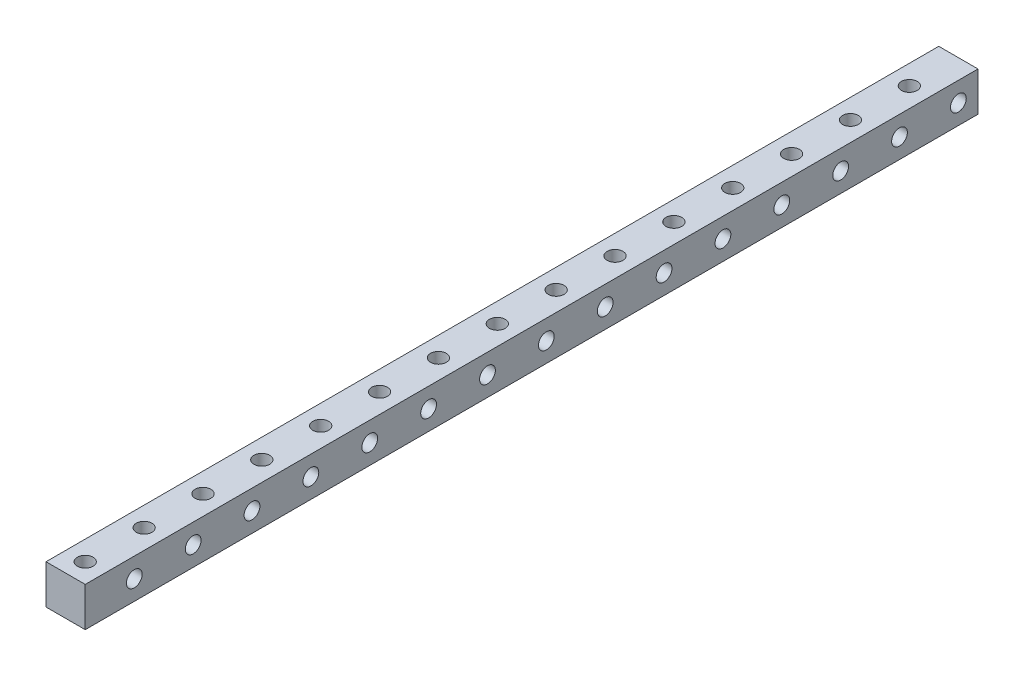
ISO-10303-21;
HEADER;
FILE_DESCRIPTION(('STEP AP214'),'2;1');
FILE_NAME('part.step','',(''),(''),'','','');
FILE_SCHEMA(('AUTOMOTIVE_DESIGN { 1 0 10303 214 1 1 1 1 }'));
ENDSEC;
DATA;
#1=APPLICATION_CONTEXT('core data for automotive mechanical design processes');
#2=APPLICATION_PROTOCOL_DEFINITION('international standard','automotive_design',2000,#1);
#3=PRODUCT_CONTEXT('',#1,'mechanical');
#4=PRODUCT('Part','Part','',(#3));
#5=PRODUCT_RELATED_PRODUCT_CATEGORY('part','',(#4));
#6=PRODUCT_DEFINITION_FORMATION('','',#4);
#7=PRODUCT_DEFINITION_CONTEXT('part definition',#1,'design');
#8=PRODUCT_DEFINITION('design','',#6,#7);
#9=PRODUCT_DEFINITION_SHAPE('','',#8);
#10=(LENGTH_UNIT() NAMED_UNIT(*) SI_UNIT(.MILLI.,.METRE.));
#11=(NAMED_UNIT(*) PLANE_ANGLE_UNIT() SI_UNIT($,.RADIAN.));
#12=(NAMED_UNIT(*) SI_UNIT($,.STERADIAN.) SOLID_ANGLE_UNIT());
#13=UNCERTAINTY_MEASURE_WITH_UNIT(LENGTH_MEASURE(1.E-05),#10,'distance_accuracy_value','');
#14=(GEOMETRIC_REPRESENTATION_CONTEXT(3) GLOBAL_UNCERTAINTY_ASSIGNED_CONTEXT((#13)) GLOBAL_UNIT_ASSIGNED_CONTEXT((#10,
#11,#12)) REPRESENTATION_CONTEXT('',''));
#15=CARTESIAN_POINT('',(0.,0.,0.));
#16=DIRECTION('',(0.,0.,1.));
#17=DIRECTION('',(1.,0.,0.));
#18=AXIS2_PLACEMENT_3D('',#15,#16,#17);
#19=CARTESIAN_POINT('',(6.35,0.,-282.575));
#20=DIRECTION('',(1.,0.,0.));
#21=DIRECTION('',(0.,0.,-1.));
#22=AXIS2_PLACEMENT_3D('',#19,#20,#21);
#23=CYLINDRICAL_SURFACE('',#22,2.55270000000002);
#24=CARTESIAN_POINT('',(6.35,0.,-282.575));
#25=DIRECTION('',(1.,0.,0.));
#26=DIRECTION('',(0.,0.,-1.));
#27=AXIS2_PLACEMENT_3D('',#24,#25,#26);
#28=CIRCLE('',#27,2.55270000000002);
#29=CARTESIAN_POINT('',(6.35,0.,-285.1277));
#30=VERTEX_POINT('',#29);
#31=EDGE_CURVE('E107',#30,#30,#28,.F.);
#32=ORIENTED_EDGE('',*,*,#31,.F.);
#33=EDGE_LOOP('',(#32));
#34=FACE_BOUND('',#33,.T.);
#35=CARTESIAN_POINT('',(-6.35,0.,-282.575));
#36=DIRECTION('',(1.,0.,0.));
#37=DIRECTION('',(0.,0.,-1.));
#38=AXIS2_PLACEMENT_3D('',#35,#36,#37);
#39=CIRCLE('',#38,2.55270000000002);
#40=CARTESIAN_POINT('',(-6.35,0.,-285.1277));
#41=VERTEX_POINT('',#40);
#42=EDGE_CURVE('E100',#41,#41,#39,.T.);
#43=ORIENTED_EDGE('',*,*,#42,.F.);
#44=EDGE_LOOP('',(#43));
#45=FACE_BOUND('',#44,.T.);
#46=ADVANCED_FACE('F20',(#34,#45),#23,.F.);
#47=CARTESIAN_POINT('',(6.35,0.,-263.525));
#48=DIRECTION('',(1.,0.,0.));
#49=DIRECTION('',(0.,0.,-1.));
#50=AXIS2_PLACEMENT_3D('',#47,#48,#49);
#51=CYLINDRICAL_SURFACE('',#50,2.55270000000002);
#52=CARTESIAN_POINT('',(6.35,0.,-263.525));
#53=DIRECTION('',(1.,0.,0.));
#54=DIRECTION('',(0.,0.,-1.));
#55=AXIS2_PLACEMENT_3D('',#52,#53,#54);
#56=CIRCLE('',#55,2.55270000000002);
#57=CARTESIAN_POINT('',(6.35,0.,-266.0777));
#58=VERTEX_POINT('',#57);
#59=EDGE_CURVE('E376',#58,#58,#56,.F.);
#60=ORIENTED_EDGE('',*,*,#59,.F.);
#61=EDGE_LOOP('',(#60));
#62=FACE_BOUND('',#61,.T.);
#63=CARTESIAN_POINT('',(-6.35,0.,-263.525));
#64=DIRECTION('',(1.,0.,0.));
#65=DIRECTION('',(0.,0.,-1.));
#66=AXIS2_PLACEMENT_3D('',#63,#64,#65);
#67=CIRCLE('',#66,2.55270000000002);
#68=CARTESIAN_POINT('',(-6.35,0.,-266.0777));
#69=VERTEX_POINT('',#68);
#70=EDGE_CURVE('E23',#69,#69,#67,.T.);
#71=ORIENTED_EDGE('',*,*,#70,.F.);
#72=EDGE_LOOP('',(#71));
#73=FACE_BOUND('',#72,.T.);
#74=ADVANCED_FACE('F182',(#62,#73),#51,.F.);
#75=CARTESIAN_POINT('',(6.35,0.,-244.475));
#76=DIRECTION('',(1.,0.,0.));
#77=DIRECTION('',(0.,0.,-1.));
#78=AXIS2_PLACEMENT_3D('',#75,#76,#77);
#79=CYLINDRICAL_SURFACE('',#78,2.55269999999999);
#80=CARTESIAN_POINT('',(6.35,0.,-244.475));
#81=DIRECTION('',(1.,0.,0.));
#82=DIRECTION('',(0.,0.,-1.));
#83=AXIS2_PLACEMENT_3D('',#80,#81,#82);
#84=CIRCLE('',#83,2.55269999999999);
#85=CARTESIAN_POINT('',(6.35,0.,-247.0277));
#86=VERTEX_POINT('',#85);
#87=EDGE_CURVE('E379',#86,#86,#84,.F.);
#88=ORIENTED_EDGE('',*,*,#87,.F.);
#89=EDGE_LOOP('',(#88));
#90=FACE_BOUND('',#89,.T.);
#91=CARTESIAN_POINT('',(-6.35,0.,-244.475));
#92=DIRECTION('',(1.,0.,0.));
#93=DIRECTION('',(0.,0.,-1.));
#94=AXIS2_PLACEMENT_3D('',#91,#92,#93);
#95=CIRCLE('',#94,2.55269999999999);
#96=CARTESIAN_POINT('',(-6.35,0.,-247.0277));
#97=VERTEX_POINT('',#96);
#98=EDGE_CURVE('E106',#97,#97,#95,.T.);
#99=ORIENTED_EDGE('',*,*,#98,.F.);
#100=EDGE_LOOP('',(#99));
#101=FACE_BOUND('',#100,.T.);
#102=ADVANCED_FACE('F184',(#90,#101),#79,.F.);
#103=CARTESIAN_POINT('',(6.35,0.,-225.425));
#104=DIRECTION('',(1.,0.,0.));
#105=DIRECTION('',(0.,0.,-1.));
#106=AXIS2_PLACEMENT_3D('',#103,#104,#105);
#107=CYLINDRICAL_SURFACE('',#106,2.55269999999999);
#108=CARTESIAN_POINT('',(6.35,0.,-225.425));
#109=DIRECTION('',(1.,0.,0.));
#110=DIRECTION('',(0.,0.,-1.));
#111=AXIS2_PLACEMENT_3D('',#108,#109,#110);
#112=CIRCLE('',#111,2.55269999999999);
#113=CARTESIAN_POINT('',(6.35,0.,-227.9777));
#114=VERTEX_POINT('',#113);
#115=EDGE_CURVE('E330',#114,#114,#112,.F.);
#116=ORIENTED_EDGE('',*,*,#115,.F.);
#117=EDGE_LOOP('',(#116));
#118=FACE_BOUND('',#117,.T.);
#119=CARTESIAN_POINT('',(-6.35,0.,-225.425));
#120=DIRECTION('',(1.,0.,0.));
#121=DIRECTION('',(0.,0.,-1.));
#122=AXIS2_PLACEMENT_3D('',#119,#120,#121);
#123=CIRCLE('',#122,2.55269999999999);
#124=CARTESIAN_POINT('',(-6.35,0.,-227.9777));
#125=VERTEX_POINT('',#124);
#126=EDGE_CURVE('E113',#125,#125,#123,.T.);
#127=ORIENTED_EDGE('',*,*,#126,.F.);
#128=EDGE_LOOP('',(#127));
#129=FACE_BOUND('',#128,.T.);
#130=ADVANCED_FACE('F191',(#118,#129),#107,.F.);
#131=CARTESIAN_POINT('',(6.35,0.,-206.375));
#132=DIRECTION('',(1.,0.,0.));
#133=DIRECTION('',(0.,0.,-1.));
#134=AXIS2_PLACEMENT_3D('',#131,#132,#133);
#135=CYLINDRICAL_SURFACE('',#134,2.55269999999999);
#136=CARTESIAN_POINT('',(6.35,0.,-206.375));
#137=DIRECTION('',(1.,0.,0.));
#138=DIRECTION('',(0.,0.,-1.));
#139=AXIS2_PLACEMENT_3D('',#136,#137,#138);
#140=CIRCLE('',#139,2.55269999999999);
#141=CARTESIAN_POINT('',(6.35,0.,-208.9277));
#142=VERTEX_POINT('',#141);
#143=EDGE_CURVE('E384',#142,#142,#140,.F.);
#144=ORIENTED_EDGE('',*,*,#143,.F.);
#145=EDGE_LOOP('',(#144));
#146=FACE_BOUND('',#145,.T.);
#147=CARTESIAN_POINT('',(-6.35,0.,-206.375));
#148=DIRECTION('',(1.,0.,0.));
#149=DIRECTION('',(0.,0.,-1.));
#150=AXIS2_PLACEMENT_3D('',#147,#148,#149);
#151=CIRCLE('',#150,2.55269999999999);
#152=CARTESIAN_POINT('',(-6.35,0.,-208.9277));
#153=VERTEX_POINT('',#152);
#154=EDGE_CURVE('E171',#153,#153,#151,.T.);
#155=ORIENTED_EDGE('',*,*,#154,.F.);
#156=EDGE_LOOP('',(#155));
#157=FACE_BOUND('',#156,.T.);
#158=ADVANCED_FACE('F318',(#146,#157),#135,.F.);
#159=CARTESIAN_POINT('',(6.35,0.,-187.325));
#160=DIRECTION('',(1.,0.,0.));
#161=DIRECTION('',(0.,0.,-1.));
#162=AXIS2_PLACEMENT_3D('',#159,#160,#161);
#163=CYLINDRICAL_SURFACE('',#162,2.55269999999999);
#164=CARTESIAN_POINT('',(6.35,0.,-187.325));
#165=DIRECTION('',(1.,0.,0.));
#166=DIRECTION('',(0.,0.,-1.));
#167=AXIS2_PLACEMENT_3D('',#164,#165,#166);
#168=CIRCLE('',#167,2.55269999999999);
#169=CARTESIAN_POINT('',(6.35,0.,-189.8777));
#170=VERTEX_POINT('',#169);
#171=EDGE_CURVE('E388',#170,#170,#168,.F.);
#172=ORIENTED_EDGE('',*,*,#171,.F.);
#173=EDGE_LOOP('',(#172));
#174=FACE_BOUND('',#173,.T.);
#175=CARTESIAN_POINT('',(-6.35,0.,-187.325));
#176=DIRECTION('',(1.,0.,0.));
#177=DIRECTION('',(0.,0.,-1.));
#178=AXIS2_PLACEMENT_3D('',#175,#176,#177);
#179=CIRCLE('',#178,2.55269999999999);
#180=CARTESIAN_POINT('',(-6.35,0.,-189.8777));
#181=VERTEX_POINT('',#180);
#182=EDGE_CURVE('E118',#181,#181,#179,.T.);
#183=ORIENTED_EDGE('',*,*,#182,.F.);
#184=EDGE_LOOP('',(#183));
#185=FACE_BOUND('',#184,.T.);
#186=ADVANCED_FACE('F314',(#174,#185),#163,.F.);
#187=CARTESIAN_POINT('',(6.35,0.,-168.275));
#188=DIRECTION('',(1.,0.,0.));
#189=DIRECTION('',(0.,0.,-1.));
#190=AXIS2_PLACEMENT_3D('',#187,#188,#189);
#191=CYLINDRICAL_SURFACE('',#190,2.55269999999999);
#192=CARTESIAN_POINT('',(6.35,0.,-168.275));
#193=DIRECTION('',(1.,0.,0.));
#194=DIRECTION('',(0.,0.,-1.));
#195=AXIS2_PLACEMENT_3D('',#192,#193,#194);
#196=CIRCLE('',#195,2.55269999999999);
#197=CARTESIAN_POINT('',(6.35,0.,-170.8277));
#198=VERTEX_POINT('',#197);
#199=EDGE_CURVE('E392',#198,#198,#196,.F.);
#200=ORIENTED_EDGE('',*,*,#199,.F.);
#201=EDGE_LOOP('',(#200));
#202=FACE_BOUND('',#201,.T.);
#203=CARTESIAN_POINT('',(-6.35,0.,-168.275));
#204=DIRECTION('',(1.,0.,0.));
#205=DIRECTION('',(0.,0.,-1.));
#206=AXIS2_PLACEMENT_3D('',#203,#204,#205);
#207=CIRCLE('',#206,2.55269999999999);
#208=CARTESIAN_POINT('',(-6.35,0.,-170.8277));
#209=VERTEX_POINT('',#208);
#210=EDGE_CURVE('E167',#209,#209,#207,.T.);
#211=ORIENTED_EDGE('',*,*,#210,.F.);
#212=EDGE_LOOP('',(#211));
#213=FACE_BOUND('',#212,.T.);
#214=ADVANCED_FACE('F310',(#202,#213),#191,.F.);
#215=CARTESIAN_POINT('',(6.35,0.,-149.225));
#216=DIRECTION('',(1.,0.,0.));
#217=DIRECTION('',(0.,0.,-1.));
#218=AXIS2_PLACEMENT_3D('',#215,#216,#217);
#219=CYLINDRICAL_SURFACE('',#218,2.55269999999999);
#220=CARTESIAN_POINT('',(6.35,0.,-149.225));
#221=DIRECTION('',(1.,0.,0.));
#222=DIRECTION('',(0.,0.,-1.));
#223=AXIS2_PLACEMENT_3D('',#220,#221,#222);
#224=CIRCLE('',#223,2.55269999999999);
#225=CARTESIAN_POINT('',(6.35,0.,-151.7777));
#226=VERTEX_POINT('',#225);
#227=EDGE_CURVE('E396',#226,#226,#224,.F.);
#228=ORIENTED_EDGE('',*,*,#227,.F.);
#229=EDGE_LOOP('',(#228));
#230=FACE_BOUND('',#229,.T.);
#231=CARTESIAN_POINT('',(-6.35,0.,-149.225));
#232=DIRECTION('',(1.,0.,0.));
#233=DIRECTION('',(0.,0.,-1.));
#234=AXIS2_PLACEMENT_3D('',#231,#232,#233);
#235=CIRCLE('',#234,2.55269999999999);
#236=CARTESIAN_POINT('',(-6.35,0.,-151.7777));
#237=VERTEX_POINT('',#236);
#238=EDGE_CURVE('E126',#237,#237,#235,.T.);
#239=ORIENTED_EDGE('',*,*,#238,.F.);
#240=EDGE_LOOP('',(#239));
#241=FACE_BOUND('',#240,.T.);
#242=ADVANCED_FACE('F306',(#230,#241),#219,.F.);
#243=CARTESIAN_POINT('',(6.35,0.,-130.175));
#244=DIRECTION('',(1.,0.,0.));
#245=DIRECTION('',(0.,0.,-1.));
#246=AXIS2_PLACEMENT_3D('',#243,#244,#245);
#247=CYLINDRICAL_SURFACE('',#246,2.55269999999999);
#248=CARTESIAN_POINT('',(6.35,0.,-130.175));
#249=DIRECTION('',(1.,0.,0.));
#250=DIRECTION('',(0.,0.,-1.));
#251=AXIS2_PLACEMENT_3D('',#248,#249,#250);
#252=CIRCLE('',#251,2.55269999999999);
#253=CARTESIAN_POINT('',(6.35,0.,-132.7277));
#254=VERTEX_POINT('',#253);
#255=EDGE_CURVE('E400',#254,#254,#252,.F.);
#256=ORIENTED_EDGE('',*,*,#255,.F.);
#257=EDGE_LOOP('',(#256));
#258=FACE_BOUND('',#257,.T.);
#259=CARTESIAN_POINT('',(-6.35,0.,-130.175));
#260=DIRECTION('',(1.,0.,0.));
#261=DIRECTION('',(0.,0.,-1.));
#262=AXIS2_PLACEMENT_3D('',#259,#260,#261);
#263=CIRCLE('',#262,2.55269999999999);
#264=CARTESIAN_POINT('',(-6.35,0.,-132.7277));
#265=VERTEX_POINT('',#264);
#266=EDGE_CURVE('E130',#265,#265,#263,.T.);
#267=ORIENTED_EDGE('',*,*,#266,.F.);
#268=EDGE_LOOP('',(#267));
#269=FACE_BOUND('',#268,.T.);
#270=ADVANCED_FACE('F302',(#258,#269),#247,.F.);
#271=CARTESIAN_POINT('',(6.35,0.,-111.125));
#272=DIRECTION('',(1.,0.,0.));
#273=DIRECTION('',(0.,0.,-1.));
#274=AXIS2_PLACEMENT_3D('',#271,#272,#273);
#275=CYLINDRICAL_SURFACE('',#274,2.55269999999999);
#276=CARTESIAN_POINT('',(6.35,0.,-111.125));
#277=DIRECTION('',(1.,0.,0.));
#278=DIRECTION('',(0.,0.,-1.));
#279=AXIS2_PLACEMENT_3D('',#276,#277,#278);
#280=CIRCLE('',#279,2.55269999999999);
#281=CARTESIAN_POINT('',(6.35,0.,-113.6777));
#282=VERTEX_POINT('',#281);
#283=EDGE_CURVE('E404',#282,#282,#280,.F.);
#284=ORIENTED_EDGE('',*,*,#283,.F.);
#285=EDGE_LOOP('',(#284));
#286=FACE_BOUND('',#285,.T.);
#287=CARTESIAN_POINT('',(-6.35,0.,-111.125));
#288=DIRECTION('',(1.,0.,0.));
#289=DIRECTION('',(0.,0.,-1.));
#290=AXIS2_PLACEMENT_3D('',#287,#288,#289);
#291=CIRCLE('',#290,2.55269999999999);
#292=CARTESIAN_POINT('',(-6.35,0.,-113.6777));
#293=VERTEX_POINT('',#292);
#294=EDGE_CURVE('E135',#293,#293,#291,.T.);
#295=ORIENTED_EDGE('',*,*,#294,.F.);
#296=EDGE_LOOP('',(#295));
#297=FACE_BOUND('',#296,.T.);
#298=ADVANCED_FACE('F298',(#286,#297),#275,.F.);
#299=CARTESIAN_POINT('',(6.35,0.,-92.075));
#300=DIRECTION('',(1.,0.,0.));
#301=DIRECTION('',(0.,0.,-1.));
#302=AXIS2_PLACEMENT_3D('',#299,#300,#301);
#303=CYLINDRICAL_SURFACE('',#302,2.55270000000001);
#304=CARTESIAN_POINT('',(6.35,0.,-92.075));
#305=DIRECTION('',(1.,0.,0.));
#306=DIRECTION('',(0.,0.,-1.));
#307=AXIS2_PLACEMENT_3D('',#304,#305,#306);
#308=CIRCLE('',#307,2.55270000000001);
#309=CARTESIAN_POINT('',(6.35,0.,-94.6277));
#310=VERTEX_POINT('',#309);
#311=EDGE_CURVE('E408',#310,#310,#308,.F.);
#312=ORIENTED_EDGE('',*,*,#311,.F.);
#313=EDGE_LOOP('',(#312));
#314=FACE_BOUND('',#313,.T.);
#315=CARTESIAN_POINT('',(-6.35,0.,-92.075));
#316=DIRECTION('',(1.,0.,0.));
#317=DIRECTION('',(0.,0.,-1.));
#318=AXIS2_PLACEMENT_3D('',#315,#316,#317);
#319=CIRCLE('',#318,2.55270000000001);
#320=CARTESIAN_POINT('',(-6.35,0.,-94.6277));
#321=VERTEX_POINT('',#320);
#322=EDGE_CURVE('E140',#321,#321,#319,.T.);
#323=ORIENTED_EDGE('',*,*,#322,.F.);
#324=EDGE_LOOP('',(#323));
#325=FACE_BOUND('',#324,.T.);
#326=ADVANCED_FACE('F294',(#314,#325),#303,.F.);
#327=CARTESIAN_POINT('',(6.35,0.,-73.025));
#328=DIRECTION('',(1.,0.,0.));
#329=DIRECTION('',(0.,0.,-1.));
#330=AXIS2_PLACEMENT_3D('',#327,#328,#329);
#331=CYLINDRICAL_SURFACE('',#330,2.55269999999999);
#332=CARTESIAN_POINT('',(6.35,0.,-73.025));
#333=DIRECTION('',(1.,0.,0.));
#334=DIRECTION('',(0.,0.,-1.));
#335=AXIS2_PLACEMENT_3D('',#332,#333,#334);
#336=CIRCLE('',#335,2.55269999999999);
#337=CARTESIAN_POINT('',(6.35,0.,-75.5777));
#338=VERTEX_POINT('',#337);
#339=EDGE_CURVE('E412',#338,#338,#336,.F.);
#340=ORIENTED_EDGE('',*,*,#339,.F.);
#341=EDGE_LOOP('',(#340));
#342=FACE_BOUND('',#341,.T.);
#343=CARTESIAN_POINT('',(-6.35,0.,-73.025));
#344=DIRECTION('',(1.,0.,0.));
#345=DIRECTION('',(0.,0.,-1.));
#346=AXIS2_PLACEMENT_3D('',#343,#344,#345);
#347=CIRCLE('',#346,2.55269999999999);
#348=CARTESIAN_POINT('',(-6.35,0.,-75.5777));
#349=VERTEX_POINT('',#348);
#350=EDGE_CURVE('E148',#349,#349,#347,.T.);
#351=ORIENTED_EDGE('',*,*,#350,.F.);
#352=EDGE_LOOP('',(#351));
#353=FACE_BOUND('',#352,.T.);
#354=ADVANCED_FACE('F290',(#342,#353),#331,.F.);
#355=CARTESIAN_POINT('',(6.35,0.,-53.975));
#356=DIRECTION('',(1.,0.,0.));
#357=DIRECTION('',(0.,0.,-1.));
#358=AXIS2_PLACEMENT_3D('',#355,#356,#357);
#359=CYLINDRICAL_SURFACE('',#358,2.5527);
#360=CARTESIAN_POINT('',(6.35,0.,-53.975));
#361=DIRECTION('',(1.,0.,0.));
#362=DIRECTION('',(0.,0.,-1.));
#363=AXIS2_PLACEMENT_3D('',#360,#361,#362);
#364=CIRCLE('',#363,2.5527);
#365=CARTESIAN_POINT('',(6.35,0.,-56.5277));
#366=VERTEX_POINT('',#365);
#367=EDGE_CURVE('E416',#366,#366,#364,.F.);
#368=ORIENTED_EDGE('',*,*,#367,.F.);
#369=EDGE_LOOP('',(#368));
#370=FACE_BOUND('',#369,.T.);
#371=CARTESIAN_POINT('',(-6.35,0.,-53.975));
#372=DIRECTION('',(1.,0.,0.));
#373=DIRECTION('',(0.,0.,-1.));
#374=AXIS2_PLACEMENT_3D('',#371,#372,#373);
#375=CIRCLE('',#374,2.5527);
#376=CARTESIAN_POINT('',(-6.35,0.,-56.5277));
#377=VERTEX_POINT('',#376);
#378=EDGE_CURVE('E152',#377,#377,#375,.T.);
#379=ORIENTED_EDGE('',*,*,#378,.F.);
#380=EDGE_LOOP('',(#379));
#381=FACE_BOUND('',#380,.T.);
#382=ADVANCED_FACE('F286',(#370,#381),#359,.F.);
#383=CARTESIAN_POINT('',(6.35,0.,-34.925));
#384=DIRECTION('',(1.,0.,0.));
#385=DIRECTION('',(0.,0.,-1.));
#386=AXIS2_PLACEMENT_3D('',#383,#384,#385);
#387=CYLINDRICAL_SURFACE('',#386,2.5527);
#388=CARTESIAN_POINT('',(6.35,0.,-34.925));
#389=DIRECTION('',(1.,0.,0.));
#390=DIRECTION('',(0.,0.,-1.));
#391=AXIS2_PLACEMENT_3D('',#388,#389,#390);
#392=CIRCLE('',#391,2.5527);
#393=CARTESIAN_POINT('',(6.35,0.,-37.4777));
#394=VERTEX_POINT('',#393);
#395=EDGE_CURVE('E420',#394,#394,#392,.F.);
#396=ORIENTED_EDGE('',*,*,#395,.F.);
#397=EDGE_LOOP('',(#396));
#398=FACE_BOUND('',#397,.T.);
#399=CARTESIAN_POINT('',(-6.35,0.,-34.925));
#400=DIRECTION('',(1.,0.,0.));
#401=DIRECTION('',(0.,0.,-1.));
#402=AXIS2_PLACEMENT_3D('',#399,#400,#401);
#403=CIRCLE('',#402,2.5527);
#404=CARTESIAN_POINT('',(-6.35,0.,-37.4777));
#405=VERTEX_POINT('',#404);
#406=EDGE_CURVE('E157',#405,#405,#403,.T.);
#407=ORIENTED_EDGE('',*,*,#406,.F.);
#408=EDGE_LOOP('',(#407));
#409=FACE_BOUND('',#408,.T.);
#410=ADVANCED_FACE('F282',(#398,#409),#387,.F.);
#411=CARTESIAN_POINT('',(6.35,0.,-15.875));
#412=DIRECTION('',(1.,0.,0.));
#413=DIRECTION('',(0.,0.,-1.));
#414=AXIS2_PLACEMENT_3D('',#411,#412,#413);
#415=CYLINDRICAL_SURFACE('',#414,2.5527);
#416=CARTESIAN_POINT('',(6.35,0.,-15.875));
#417=DIRECTION('',(1.,0.,0.));
#418=DIRECTION('',(0.,0.,-1.));
#419=AXIS2_PLACEMENT_3D('',#416,#417,#418);
#420=CIRCLE('',#419,2.5527);
#421=CARTESIAN_POINT('',(6.35,0.,-18.4277));
#422=VERTEX_POINT('',#421);
#423=EDGE_CURVE('E424',#422,#422,#420,.F.);
#424=ORIENTED_EDGE('',*,*,#423,.F.);
#425=EDGE_LOOP('',(#424));
#426=FACE_BOUND('',#425,.T.);
#427=CARTESIAN_POINT('',(-6.35,0.,-15.875));
#428=DIRECTION('',(1.,0.,0.));
#429=DIRECTION('',(0.,0.,-1.));
#430=AXIS2_PLACEMENT_3D('',#427,#428,#429);
#431=CIRCLE('',#430,2.5527);
#432=CARTESIAN_POINT('',(-6.35,0.,-18.4277));
#433=VERTEX_POINT('',#432);
#434=EDGE_CURVE('E162',#433,#433,#431,.T.);
#435=ORIENTED_EDGE('',*,*,#434,.F.);
#436=EDGE_LOOP('',(#435));
#437=FACE_BOUND('',#436,.T.);
#438=ADVANCED_FACE('F278',(#426,#437),#415,.F.);
#439=CARTESIAN_POINT('',(6.35,-6.35,-304.8));
#440=DIRECTION('',(0.,-1.,0.));
#441=DIRECTION('',(1.,0.,0.));
#442=AXIS2_PLACEMENT_3D('',#439,#440,#441);
#443=PLANE('',#442);
#444=CARTESIAN_POINT('',(0.,-6.35,-254.));
#445=DIRECTION('',(0.,1.,0.));
#446=DIRECTION('',(0.,0.,1.));
#447=AXIS2_PLACEMENT_3D('',#444,#445,#446);
#448=CIRCLE('',#447,2.55270000000002);
#449=CARTESIAN_POINT('',(0.,-6.35,-251.4473));
#450=VERTEX_POINT('',#449);
#451=EDGE_CURVE('E432',#450,#450,#448,.T.);
#452=ORIENTED_EDGE('',*,*,#451,.T.);
#453=EDGE_LOOP('',(#452));
#454=FACE_BOUND('',#453,.T.);
#455=CARTESIAN_POINT('',(0.,-6.35,-215.9));
#456=DIRECTION('',(0.,1.,0.));
#457=DIRECTION('',(0.,0.,1.));
#458=AXIS2_PLACEMENT_3D('',#455,#456,#457);
#459=CIRCLE('',#458,2.55269999999999);
#460=CARTESIAN_POINT('',(0.,-6.35,-213.3473));
#461=VERTEX_POINT('',#460);
#462=EDGE_CURVE('E439',#461,#461,#459,.T.);
#463=ORIENTED_EDGE('',*,*,#462,.T.);
#464=EDGE_LOOP('',(#463));
#465=FACE_BOUND('',#464,.T.);
#466=CARTESIAN_POINT('',(0.,-6.35,-196.85));
#467=DIRECTION('',(0.,1.,0.));
#468=DIRECTION('',(0.,0.,1.));
#469=AXIS2_PLACEMENT_3D('',#466,#467,#468);
#470=CIRCLE('',#469,2.55269999999999);
#471=CARTESIAN_POINT('',(0.,-6.35,-194.2973));
#472=VERTEX_POINT('',#471);
#473=EDGE_CURVE('E443',#472,#472,#470,.T.);
#474=ORIENTED_EDGE('',*,*,#473,.T.);
#475=EDGE_LOOP('',(#474));
#476=FACE_BOUND('',#475,.T.);
#477=CARTESIAN_POINT('',(0.,-6.35,-177.8));
#478=DIRECTION('',(0.,1.,0.));
#479=DIRECTION('',(0.,0.,1.));
#480=AXIS2_PLACEMENT_3D('',#477,#478,#479);
#481=CIRCLE('',#480,2.55269999999999);
#482=CARTESIAN_POINT('',(0.,-6.35,-175.2473));
#483=VERTEX_POINT('',#482);
#484=EDGE_CURVE('E447',#483,#483,#481,.T.);
#485=ORIENTED_EDGE('',*,*,#484,.T.);
#486=EDGE_LOOP('',(#485));
#487=FACE_BOUND('',#486,.T.);
#488=CARTESIAN_POINT('',(0.,-6.35,-158.75));
#489=DIRECTION('',(0.,1.,0.));
#490=DIRECTION('',(0.,0.,1.));
#491=AXIS2_PLACEMENT_3D('',#488,#489,#490);
#492=CIRCLE('',#491,2.55269999999999);
#493=CARTESIAN_POINT('',(0.,-6.35,-156.1973));
#494=VERTEX_POINT('',#493);
#495=EDGE_CURVE('E451',#494,#494,#492,.T.);
#496=ORIENTED_EDGE('',*,*,#495,.T.);
#497=EDGE_LOOP('',(#496));
#498=FACE_BOUND('',#497,.T.);
#499=CARTESIAN_POINT('',(0.,-6.35,-139.7));
#500=DIRECTION('',(0.,1.,0.));
#501=DIRECTION('',(0.,0.,1.));
#502=AXIS2_PLACEMENT_3D('',#499,#500,#501);
#503=CIRCLE('',#502,2.55269999999999);
#504=CARTESIAN_POINT('',(0.,-6.35,-137.1473));
#505=VERTEX_POINT('',#504);
#506=EDGE_CURVE('E455',#505,#505,#503,.T.);
#507=ORIENTED_EDGE('',*,*,#506,.T.);
#508=EDGE_LOOP('',(#507));
#509=FACE_BOUND('',#508,.T.);
#510=CARTESIAN_POINT('',(0.,-6.35,-120.65));
#511=DIRECTION('',(0.,1.,0.));
#512=DIRECTION('',(0.,0.,1.));
#513=AXIS2_PLACEMENT_3D('',#510,#511,#512);
#514=CIRCLE('',#513,2.55269999999999);
#515=CARTESIAN_POINT('',(0.,-6.35,-118.0973));
#516=VERTEX_POINT('',#515);
#517=EDGE_CURVE('E459',#516,#516,#514,.T.);
#518=ORIENTED_EDGE('',*,*,#517,.T.);
#519=EDGE_LOOP('',(#518));
#520=FACE_BOUND('',#519,.T.);
#521=CARTESIAN_POINT('',(0.,-6.35,-101.6));
#522=DIRECTION('',(0.,1.,0.));
#523=DIRECTION('',(0.,0.,1.));
#524=AXIS2_PLACEMENT_3D('',#521,#522,#523);
#525=CIRCLE('',#524,2.55269999999999);
#526=CARTESIAN_POINT('',(0.,-6.35,-99.0473));
#527=VERTEX_POINT('',#526);
#528=EDGE_CURVE('E463',#527,#527,#525,.T.);
#529=ORIENTED_EDGE('',*,*,#528,.T.);
#530=EDGE_LOOP('',(#529));
#531=FACE_BOUND('',#530,.T.);
#532=CARTESIAN_POINT('',(0.,-6.35,-82.55));
#533=DIRECTION('',(0.,1.,0.));
#534=DIRECTION('',(0.,0.,1.));
#535=AXIS2_PLACEMENT_3D('',#532,#533,#534);
#536=CIRCLE('',#535,2.55269999999999);
#537=CARTESIAN_POINT('',(0.,-6.35,-79.9973));
#538=VERTEX_POINT('',#537);
#539=EDGE_CURVE('E467',#538,#538,#536,.T.);
#540=ORIENTED_EDGE('',*,*,#539,.T.);
#541=EDGE_LOOP('',(#540));
#542=FACE_BOUND('',#541,.T.);
#543=CARTESIAN_POINT('',(0.,-6.35,-63.5));
#544=DIRECTION('',(0.,1.,0.));
#545=DIRECTION('',(0.,0.,1.));
#546=AXIS2_PLACEMENT_3D('',#543,#544,#545);
#547=CIRCLE('',#546,2.5527);
#548=CARTESIAN_POINT('',(0.,-6.35,-60.9473));
#549=VERTEX_POINT('',#548);
#550=EDGE_CURVE('E471',#549,#549,#547,.T.);
#551=ORIENTED_EDGE('',*,*,#550,.T.);
#552=EDGE_LOOP('',(#551));
#553=FACE_BOUND('',#552,.T.);
#554=CARTESIAN_POINT('',(0.,-6.35,-44.45));
#555=DIRECTION('',(0.,1.,0.));
#556=DIRECTION('',(0.,0.,1.));
#557=AXIS2_PLACEMENT_3D('',#554,#555,#556);
#558=CIRCLE('',#557,2.5527);
#559=CARTESIAN_POINT('',(0.,-6.35,-41.8973));
#560=VERTEX_POINT('',#559);
#561=EDGE_CURVE('E475',#560,#560,#558,.T.);
#562=ORIENTED_EDGE('',*,*,#561,.T.);
#563=EDGE_LOOP('',(#562));
#564=FACE_BOUND('',#563,.T.);
#565=CARTESIAN_POINT('',(0.,-6.35,-25.4));
#566=DIRECTION('',(0.,1.,0.));
#567=DIRECTION('',(0.,0.,1.));
#568=AXIS2_PLACEMENT_3D('',#565,#566,#567);
#569=CIRCLE('',#568,2.5527);
#570=CARTESIAN_POINT('',(0.,-6.35,-22.8473));
#571=VERTEX_POINT('',#570);
#572=EDGE_CURVE('E479',#571,#571,#569,.T.);
#573=ORIENTED_EDGE('',*,*,#572,.T.);
#574=EDGE_LOOP('',(#573));
#575=FACE_BOUND('',#574,.T.);
#576=CARTESIAN_POINT('',(0.,-6.35,-6.35));
#577=DIRECTION('',(0.,1.,0.));
#578=DIRECTION('',(0.,0.,1.));
#579=AXIS2_PLACEMENT_3D('',#576,#577,#578);
#580=CIRCLE('',#579,2.5527);
#581=CARTESIAN_POINT('',(0.,-6.35,-3.7973));
#582=VERTEX_POINT('',#581);
#583=EDGE_CURVE('E483',#582,#582,#580,.T.);
#584=ORIENTED_EDGE('',*,*,#583,.T.);
#585=EDGE_LOOP('',(#584));
#586=FACE_BOUND('',#585,.T.);
#587=CARTESIAN_POINT('',(0.,-6.35,-234.95));
#588=DIRECTION('',(0.,1.,0.));
#589=DIRECTION('',(0.,0.,1.));
#590=AXIS2_PLACEMENT_3D('',#587,#588,#589);
#591=CIRCLE('',#590,2.55269999999999);
#592=CARTESIAN_POINT('',(0.,-6.35,-232.3973));
#593=VERTEX_POINT('',#592);
#594=EDGE_CURVE('E435',#593,#593,#591,.T.);
#595=ORIENTED_EDGE('',*,*,#594,.T.);
#596=EDGE_LOOP('',(#595));
#597=FACE_BOUND('',#596,.T.);
#598=CARTESIAN_POINT('',(0.,-6.35,-273.05));
#599=DIRECTION('',(0.,1.,0.));
#600=DIRECTION('',(0.,0.,1.));
#601=AXIS2_PLACEMENT_3D('',#598,#599,#600);
#602=CIRCLE('',#601,2.55270000000002);
#603=CARTESIAN_POINT('',(0.,-6.35,-270.4973));
#604=VERTEX_POINT('',#603);
#605=EDGE_CURVE('E428',#604,#604,#602,.T.);
#606=ORIENTED_EDGE('',*,*,#605,.T.);
#607=EDGE_LOOP('',(#606));
#608=FACE_BOUND('',#607,.T.);
#609=DIRECTION('',(1.,0.,0.));
#610=VECTOR('',#609,1.);
#611=CARTESIAN_POINT('',(-6.35,-6.35,0.));
#612=LINE('',#611,#610);
#613=CARTESIAN_POINT('',(-6.35,-6.35000000000003,0.));
#614=VERTEX_POINT('',#613);
#615=CARTESIAN_POINT('',(6.35,-6.35,0.));
#616=VERTEX_POINT('',#615);
#617=EDGE_CURVE('E77',#614,#616,#612,.T.);
#618=ORIENTED_EDGE('',*,*,#617,.F.);
#619=DIRECTION('',(0.,0.,1.));
#620=VECTOR('',#619,1.);
#621=CARTESIAN_POINT('',(-6.35,-6.35000000000005,-304.8));
#622=LINE('',#621,#620);
#623=CARTESIAN_POINT('',(-6.35,-6.35000000000004,-288.925));
#624=VERTEX_POINT('',#623);
#625=EDGE_CURVE('E60',#624,#614,#622,.T.);
#626=ORIENTED_EDGE('',*,*,#625,.F.);
#627=DIRECTION('',(1.,0.,0.));
#628=VECTOR('',#627,1.);
#629=CARTESIAN_POINT('',(-6.35000000000001,-6.35000000000005,-288.925));
#630=LINE('',#629,#628);
#631=CARTESIAN_POINT('',(6.35,-6.35000000000002,-288.925));
#632=VERTEX_POINT('',#631);
#633=EDGE_CURVE('E65',#624,#632,#630,.T.);
#634=ORIENTED_EDGE('',*,*,#633,.T.);
#635=DIRECTION('',(0.,0.,-1.));
#636=VECTOR('',#635,1.);
#637=CARTESIAN_POINT('',(6.35,-6.35,-304.8));
#638=LINE('',#637,#636);
#639=EDGE_CURVE('E370',#616,#632,#638,.T.);
#640=ORIENTED_EDGE('',*,*,#639,.F.);
#641=EDGE_LOOP('',(#618,#626,#634,#640));
#642=FACE_BOUND('',#641,.T.);
#643=ADVANCED_FACE('F76',(#454,#465,#476,#487,#498,#509,#520,#531,#542,#553,#564,#575,#586,#597,
#608,#642),#443,.T.);
#644=CARTESIAN_POINT('',(-6.35000000000001,6.35000000000005,-288.925));
#645=DIRECTION('',(0.,0.,1.));
#646=DIRECTION('',(1.,0.,0.));
#647=AXIS2_PLACEMENT_3D('',#644,#645,#646);
#648=PLANE('',#647);
#649=ORIENTED_EDGE('',*,*,#633,.F.);
#650=DIRECTION('',(0.,1.,0.));
#651=VECTOR('',#650,1.);
#652=CARTESIAN_POINT('',(-6.35,-6.35,-288.925));
#653=LINE('',#652,#651);
#654=CARTESIAN_POINT('',(-6.35,6.35,-288.925));
#655=VERTEX_POINT('',#654);
#656=EDGE_CURVE('E67',#655,#624,#653,.F.);
#657=ORIENTED_EDGE('',*,*,#656,.F.);
#658=DIRECTION('',(-1.,0.,0.));
#659=VECTOR('',#658,1.);
#660=CARTESIAN_POINT('',(6.35,6.35,-288.925));
#661=LINE('',#660,#659);
#662=CARTESIAN_POINT('',(6.35,6.35,-288.925));
#663=VERTEX_POINT('',#662);
#664=EDGE_CURVE('E487',#663,#655,#661,.T.);
#665=ORIENTED_EDGE('',*,*,#664,.F.);
#666=DIRECTION('',(0.,1.,0.));
#667=VECTOR('',#666,1.);
#668=CARTESIAN_POINT('',(6.35,-6.35,-288.925));
#669=LINE('',#668,#667);
#670=EDGE_CURVE('E70',#632,#663,#669,.T.);
#671=ORIENTED_EDGE('',*,*,#670,.F.);
#672=EDGE_LOOP('',(#649,#657,#665,#671));
#673=FACE_BOUND('',#672,.T.);
#674=ADVANCED_FACE('F66',(#673),#648,.F.);
#675=CARTESIAN_POINT('',(-6.35,-6.35,-304.8));
#676=DIRECTION('',(-1.,0.,0.));
#677=DIRECTION('',(0.,0.,1.));
#678=AXIS2_PLACEMENT_3D('',#675,#676,#677);
#679=PLANE('',#678);
#680=ORIENTED_EDGE('',*,*,#42,.T.);
#681=EDGE_LOOP('',(#680));
#682=FACE_BOUND('',#681,.T.);
#683=ORIENTED_EDGE('',*,*,#98,.T.);
#684=EDGE_LOOP('',(#683));
#685=FACE_BOUND('',#684,.T.);
#686=ORIENTED_EDGE('',*,*,#126,.T.);
#687=EDGE_LOOP('',(#686));
#688=FACE_BOUND('',#687,.T.);
#689=ORIENTED_EDGE('',*,*,#182,.T.);
#690=EDGE_LOOP('',(#689));
#691=FACE_BOUND('',#690,.T.);
#692=ORIENTED_EDGE('',*,*,#238,.T.);
#693=EDGE_LOOP('',(#692));
#694=FACE_BOUND('',#693,.T.);
#695=ORIENTED_EDGE('',*,*,#266,.T.);
#696=EDGE_LOOP('',(#695));
#697=FACE_BOUND('',#696,.T.);
#698=ORIENTED_EDGE('',*,*,#294,.T.);
#699=EDGE_LOOP('',(#698));
#700=FACE_BOUND('',#699,.T.);
#701=ORIENTED_EDGE('',*,*,#322,.T.);
#702=EDGE_LOOP('',(#701));
#703=FACE_BOUND('',#702,.T.);
#704=ORIENTED_EDGE('',*,*,#350,.T.);
#705=EDGE_LOOP('',(#704));
#706=FACE_BOUND('',#705,.T.);
#707=ORIENTED_EDGE('',*,*,#378,.T.);
#708=EDGE_LOOP('',(#707));
#709=FACE_BOUND('',#708,.T.);
#710=ORIENTED_EDGE('',*,*,#406,.T.);
#711=EDGE_LOOP('',(#710));
#712=FACE_BOUND('',#711,.T.);
#713=ORIENTED_EDGE('',*,*,#434,.T.);
#714=EDGE_LOOP('',(#713));
#715=FACE_BOUND('',#714,.T.);
#716=ORIENTED_EDGE('',*,*,#210,.T.);
#717=EDGE_LOOP('',(#716));
#718=FACE_BOUND('',#717,.T.);
#719=ORIENTED_EDGE('',*,*,#154,.T.);
#720=EDGE_LOOP('',(#719));
#721=FACE_BOUND('',#720,.T.);
#722=ORIENTED_EDGE('',*,*,#70,.T.);
#723=EDGE_LOOP('',(#722));
#724=FACE_BOUND('',#723,.T.);
#725=DIRECTION('',(0.,1.,0.));
#726=VECTOR('',#725,1.);
#727=CARTESIAN_POINT('',(-6.35,6.35,0.));
#728=LINE('',#727,#726);
#729=CARTESIAN_POINT('',(-6.35,6.35,0.));
#730=VERTEX_POINT('',#729);
#731=EDGE_CURVE('E105',#730,#614,#728,.F.);
#732=ORIENTED_EDGE('',*,*,#731,.F.);
#733=DIRECTION('',(0.,0.,1.));
#734=VECTOR('',#733,1.);
#735=CARTESIAN_POINT('',(-6.35,6.35,-304.8));
#736=LINE('',#735,#734);
#737=EDGE_CURVE('E83',#655,#730,#736,.T.);
#738=ORIENTED_EDGE('',*,*,#737,.F.);
#739=ORIENTED_EDGE('',*,*,#656,.T.);
#740=ORIENTED_EDGE('',*,*,#625,.T.);
#741=EDGE_LOOP('',(#732,#738,#739,#740));
#742=FACE_BOUND('',#741,.T.);
#743=ADVANCED_FACE('F81',(#682,#685,#688,#691,#694,#697,#700,#703,#706,#709,#712,#715,#718,#721,
#724,#742),#679,.T.);
#744=CARTESIAN_POINT('',(-6.35,6.35,0.));
#745=DIRECTION('',(0.,0.,1.));
#746=DIRECTION('',(1.,0.,0.));
#747=AXIS2_PLACEMENT_3D('',#744,#745,#746);
#748=PLANE('',#747);
#749=DIRECTION('',(0.,1.,0.));
#750=VECTOR('',#749,1.);
#751=CARTESIAN_POINT('',(6.35,-6.35,0.));
#752=LINE('',#751,#750);
#753=CARTESIAN_POINT('',(6.35,6.35,0.));
#754=VERTEX_POINT('',#753);
#755=EDGE_CURVE('E40',#754,#616,#752,.F.);
#756=ORIENTED_EDGE('',*,*,#755,.F.);
#757=DIRECTION('',(-1.,0.,0.));
#758=VECTOR('',#757,1.);
#759=CARTESIAN_POINT('',(6.35,6.35,0.));
#760=LINE('',#759,#758);
#761=EDGE_CURVE('E492',#730,#754,#760,.F.);
#762=ORIENTED_EDGE('',*,*,#761,.F.);
#763=ORIENTED_EDGE('',*,*,#731,.T.);
#764=ORIENTED_EDGE('',*,*,#617,.T.);
#765=EDGE_LOOP('',(#756,#762,#763,#764));
#766=FACE_BOUND('',#765,.T.);
#767=ADVANCED_FACE('F267',(#766),#748,.T.);
#768=CARTESIAN_POINT('',(6.35,-6.35,-304.8));
#769=DIRECTION('',(1.,0.,0.));
#770=DIRECTION('',(0.,0.,-1.));
#771=AXIS2_PLACEMENT_3D('',#768,#769,#770);
#772=PLANE('',#771);
#773=ORIENTED_EDGE('',*,*,#423,.T.);
#774=EDGE_LOOP('',(#773));
#775=FACE_BOUND('',#774,.T.);
#776=ORIENTED_EDGE('',*,*,#395,.T.);
#777=EDGE_LOOP('',(#776));
#778=FACE_BOUND('',#777,.T.);
#779=ORIENTED_EDGE('',*,*,#367,.T.);
#780=EDGE_LOOP('',(#779));
#781=FACE_BOUND('',#780,.T.);
#782=ORIENTED_EDGE('',*,*,#339,.T.);
#783=EDGE_LOOP('',(#782));
#784=FACE_BOUND('',#783,.T.);
#785=ORIENTED_EDGE('',*,*,#311,.T.);
#786=EDGE_LOOP('',(#785));
#787=FACE_BOUND('',#786,.T.);
#788=ORIENTED_EDGE('',*,*,#283,.T.);
#789=EDGE_LOOP('',(#788));
#790=FACE_BOUND('',#789,.T.);
#791=ORIENTED_EDGE('',*,*,#255,.T.);
#792=EDGE_LOOP('',(#791));
#793=FACE_BOUND('',#792,.T.);
#794=ORIENTED_EDGE('',*,*,#227,.T.);
#795=EDGE_LOOP('',(#794));
#796=FACE_BOUND('',#795,.T.);
#797=ORIENTED_EDGE('',*,*,#199,.T.);
#798=EDGE_LOOP('',(#797));
#799=FACE_BOUND('',#798,.T.);
#800=ORIENTED_EDGE('',*,*,#171,.T.);
#801=EDGE_LOOP('',(#800));
#802=FACE_BOUND('',#801,.T.);
#803=ORIENTED_EDGE('',*,*,#143,.T.);
#804=EDGE_LOOP('',(#803));
#805=FACE_BOUND('',#804,.T.);
#806=ORIENTED_EDGE('',*,*,#115,.T.);
#807=EDGE_LOOP('',(#806));
#808=FACE_BOUND('',#807,.T.);
#809=ORIENTED_EDGE('',*,*,#87,.T.);
#810=EDGE_LOOP('',(#809));
#811=FACE_BOUND('',#810,.T.);
#812=ORIENTED_EDGE('',*,*,#59,.T.);
#813=EDGE_LOOP('',(#812));
#814=FACE_BOUND('',#813,.T.);
#815=ORIENTED_EDGE('',*,*,#31,.T.);
#816=EDGE_LOOP('',(#815));
#817=FACE_BOUND('',#816,.T.);
#818=ORIENTED_EDGE('',*,*,#755,.T.);
#819=ORIENTED_EDGE('',*,*,#639,.T.);
#820=ORIENTED_EDGE('',*,*,#670,.T.);
#821=DIRECTION('',(0.,0.,1.));
#822=VECTOR('',#821,1.);
#823=CARTESIAN_POINT('',(6.35,6.35,-304.8));
#824=LINE('',#823,#822);
#825=EDGE_CURVE('E496',#754,#663,#824,.F.);
#826=ORIENTED_EDGE('',*,*,#825,.F.);
#827=EDGE_LOOP('',(#818,#819,#820,#826));
#828=FACE_BOUND('',#827,.T.);
#829=ADVANCED_FACE('F263',(#775,#778,#781,#784,#787,#790,#793,#796,#799,#802,#805,#808,#811,
#814,#817,#828),#772,.T.);
#830=CARTESIAN_POINT('',(0.,6.35,-273.05));
#831=DIRECTION('',(0.,1.,0.));
#832=DIRECTION('',(0.,0.,1.));
#833=AXIS2_PLACEMENT_3D('',#830,#831,#832);
#834=CYLINDRICAL_SURFACE('',#833,2.55270000000002);
#835=CARTESIAN_POINT('',(0.,6.35,-273.05));
#836=DIRECTION('',(0.,1.,0.));
#837=DIRECTION('',(0.,0.,1.));
#838=AXIS2_PLACEMENT_3D('',#835,#836,#837);
#839=CIRCLE('',#838,2.55270000000002);
#840=CARTESIAN_POINT('',(0.,6.35,-270.4973));
#841=VERTEX_POINT('',#840);
#842=EDGE_CURVE('E500',#841,#841,#839,.F.);
#843=ORIENTED_EDGE('',*,*,#842,.F.);
#844=EDGE_LOOP('',(#843));
#845=FACE_BOUND('',#844,.T.);
#846=ORIENTED_EDGE('',*,*,#605,.F.);
#847=EDGE_LOOP('',(#846));
#848=FACE_BOUND('',#847,.T.);
#849=ADVANCED_FACE('F259',(#845,#848),#834,.F.);
#850=CARTESIAN_POINT('',(0.,6.35,-254.));
#851=DIRECTION('',(0.,1.,0.));
#852=DIRECTION('',(0.,0.,1.));
#853=AXIS2_PLACEMENT_3D('',#850,#851,#852);
#854=CYLINDRICAL_SURFACE('',#853,2.55270000000002);
#855=CARTESIAN_POINT('',(0.,6.35,-254.));
#856=DIRECTION('',(0.,1.,0.));
#857=DIRECTION('',(0.,0.,1.));
#858=AXIS2_PLACEMENT_3D('',#855,#856,#857);
#859=CIRCLE('',#858,2.55270000000002);
#860=CARTESIAN_POINT('',(0.,6.35,-251.4473));
#861=VERTEX_POINT('',#860);
#862=EDGE_CURVE('E504',#861,#861,#859,.F.);
#863=ORIENTED_EDGE('',*,*,#862,.F.);
#864=EDGE_LOOP('',(#863));
#865=FACE_BOUND('',#864,.T.);
#866=ORIENTED_EDGE('',*,*,#451,.F.);
#867=EDGE_LOOP('',(#866));
#868=FACE_BOUND('',#867,.T.);
#869=ADVANCED_FACE('F255',(#865,#868),#854,.F.);
#870=CARTESIAN_POINT('',(0.,6.35,-234.95));
#871=DIRECTION('',(0.,1.,0.));
#872=DIRECTION('',(0.,0.,1.));
#873=AXIS2_PLACEMENT_3D('',#870,#871,#872);
#874=CYLINDRICAL_SURFACE('',#873,2.55269999999999);
#875=CARTESIAN_POINT('',(0.,6.35,-234.95));
#876=DIRECTION('',(0.,1.,0.));
#877=DIRECTION('',(0.,0.,1.));
#878=AXIS2_PLACEMENT_3D('',#875,#876,#877);
#879=CIRCLE('',#878,2.55269999999999);
#880=CARTESIAN_POINT('',(0.,6.35,-232.3973));
#881=VERTEX_POINT('',#880);
#882=EDGE_CURVE('E508',#881,#881,#879,.F.);
#883=ORIENTED_EDGE('',*,*,#882,.F.);
#884=EDGE_LOOP('',(#883));
#885=FACE_BOUND('',#884,.T.);
#886=ORIENTED_EDGE('',*,*,#594,.F.);
#887=EDGE_LOOP('',(#886));
#888=FACE_BOUND('',#887,.T.);
#889=ADVANCED_FACE('F251',(#885,#888),#874,.F.);
#890=CARTESIAN_POINT('',(0.,6.35,-215.9));
#891=DIRECTION('',(0.,1.,0.));
#892=DIRECTION('',(0.,0.,1.));
#893=AXIS2_PLACEMENT_3D('',#890,#891,#892);
#894=CYLINDRICAL_SURFACE('',#893,2.55269999999999);
#895=CARTESIAN_POINT('',(0.,6.35,-215.9));
#896=DIRECTION('',(0.,1.,0.));
#897=DIRECTION('',(0.,0.,1.));
#898=AXIS2_PLACEMENT_3D('',#895,#896,#897);
#899=CIRCLE('',#898,2.55269999999999);
#900=CARTESIAN_POINT('',(0.,6.35,-213.3473));
#901=VERTEX_POINT('',#900);
#902=EDGE_CURVE('E512',#901,#901,#899,.F.);
#903=ORIENTED_EDGE('',*,*,#902,.F.);
#904=EDGE_LOOP('',(#903));
#905=FACE_BOUND('',#904,.T.);
#906=ORIENTED_EDGE('',*,*,#462,.F.);
#907=EDGE_LOOP('',(#906));
#908=FACE_BOUND('',#907,.T.);
#909=ADVANCED_FACE('F247',(#905,#908),#894,.F.);
#910=CARTESIAN_POINT('',(0.,6.35,-196.85));
#911=DIRECTION('',(0.,1.,0.));
#912=DIRECTION('',(0.,0.,1.));
#913=AXIS2_PLACEMENT_3D('',#910,#911,#912);
#914=CYLINDRICAL_SURFACE('',#913,2.55269999999999);
#915=CARTESIAN_POINT('',(0.,6.35,-196.85));
#916=DIRECTION('',(0.,1.,0.));
#917=DIRECTION('',(0.,0.,1.));
#918=AXIS2_PLACEMENT_3D('',#915,#916,#917);
#919=CIRCLE('',#918,2.55269999999999);
#920=CARTESIAN_POINT('',(0.,6.35,-194.2973));
#921=VERTEX_POINT('',#920);
#922=EDGE_CURVE('E516',#921,#921,#919,.F.);
#923=ORIENTED_EDGE('',*,*,#922,.F.);
#924=EDGE_LOOP('',(#923));
#925=FACE_BOUND('',#924,.T.);
#926=ORIENTED_EDGE('',*,*,#473,.F.);
#927=EDGE_LOOP('',(#926));
#928=FACE_BOUND('',#927,.T.);
#929=ADVANCED_FACE('F243',(#925,#928),#914,.F.);
#930=CARTESIAN_POINT('',(0.,6.35,-177.8));
#931=DIRECTION('',(0.,1.,0.));
#932=DIRECTION('',(0.,0.,1.));
#933=AXIS2_PLACEMENT_3D('',#930,#931,#932);
#934=CYLINDRICAL_SURFACE('',#933,2.55269999999999);
#935=CARTESIAN_POINT('',(0.,6.35,-177.8));
#936=DIRECTION('',(0.,1.,0.));
#937=DIRECTION('',(0.,0.,1.));
#938=AXIS2_PLACEMENT_3D('',#935,#936,#937);
#939=CIRCLE('',#938,2.55269999999999);
#940=CARTESIAN_POINT('',(0.,6.35,-175.2473));
#941=VERTEX_POINT('',#940);
#942=EDGE_CURVE('E520',#941,#941,#939,.F.);
#943=ORIENTED_EDGE('',*,*,#942,.F.);
#944=EDGE_LOOP('',(#943));
#945=FACE_BOUND('',#944,.T.);
#946=ORIENTED_EDGE('',*,*,#484,.F.);
#947=EDGE_LOOP('',(#946));
#948=FACE_BOUND('',#947,.T.);
#949=ADVANCED_FACE('F239',(#945,#948),#934,.F.);
#950=CARTESIAN_POINT('',(0.,6.35,-158.75));
#951=DIRECTION('',(0.,1.,0.));
#952=DIRECTION('',(0.,0.,1.));
#953=AXIS2_PLACEMENT_3D('',#950,#951,#952);
#954=CYLINDRICAL_SURFACE('',#953,2.55269999999999);
#955=CARTESIAN_POINT('',(0.,6.35,-158.75));
#956=DIRECTION('',(0.,1.,0.));
#957=DIRECTION('',(0.,0.,1.));
#958=AXIS2_PLACEMENT_3D('',#955,#956,#957);
#959=CIRCLE('',#958,2.55269999999999);
#960=CARTESIAN_POINT('',(0.,6.35,-156.1973));
#961=VERTEX_POINT('',#960);
#962=EDGE_CURVE('E524',#961,#961,#959,.F.);
#963=ORIENTED_EDGE('',*,*,#962,.F.);
#964=EDGE_LOOP('',(#963));
#965=FACE_BOUND('',#964,.T.);
#966=ORIENTED_EDGE('',*,*,#495,.F.);
#967=EDGE_LOOP('',(#966));
#968=FACE_BOUND('',#967,.T.);
#969=ADVANCED_FACE('F235',(#965,#968),#954,.F.);
#970=CARTESIAN_POINT('',(0.,6.35,-139.7));
#971=DIRECTION('',(0.,1.,0.));
#972=DIRECTION('',(0.,0.,1.));
#973=AXIS2_PLACEMENT_3D('',#970,#971,#972);
#974=CYLINDRICAL_SURFACE('',#973,2.55269999999999);
#975=CARTESIAN_POINT('',(0.,6.35,-139.7));
#976=DIRECTION('',(0.,1.,0.));
#977=DIRECTION('',(0.,0.,1.));
#978=AXIS2_PLACEMENT_3D('',#975,#976,#977);
#979=CIRCLE('',#978,2.55269999999999);
#980=CARTESIAN_POINT('',(0.,6.35,-137.1473));
#981=VERTEX_POINT('',#980);
#982=EDGE_CURVE('E528',#981,#981,#979,.F.);
#983=ORIENTED_EDGE('',*,*,#982,.F.);
#984=EDGE_LOOP('',(#983));
#985=FACE_BOUND('',#984,.T.);
#986=ORIENTED_EDGE('',*,*,#506,.F.);
#987=EDGE_LOOP('',(#986));
#988=FACE_BOUND('',#987,.T.);
#989=ADVANCED_FACE('F231',(#985,#988),#974,.F.);
#990=CARTESIAN_POINT('',(0.,6.35,-120.65));
#991=DIRECTION('',(0.,1.,0.));
#992=DIRECTION('',(0.,0.,1.));
#993=AXIS2_PLACEMENT_3D('',#990,#991,#992);
#994=CYLINDRICAL_SURFACE('',#993,2.55269999999999);
#995=CARTESIAN_POINT('',(0.,6.35,-120.65));
#996=DIRECTION('',(0.,1.,0.));
#997=DIRECTION('',(0.,0.,1.));
#998=AXIS2_PLACEMENT_3D('',#995,#996,#997);
#999=CIRCLE('',#998,2.55269999999999);
#1000=CARTESIAN_POINT('',(0.,6.35,-118.0973));
#1001=VERTEX_POINT('',#1000);
#1002=EDGE_CURVE('E532',#1001,#1001,#999,.F.);
#1003=ORIENTED_EDGE('',*,*,#1002,.F.);
#1004=EDGE_LOOP('',(#1003));
#1005=FACE_BOUND('',#1004,.T.);
#1006=ORIENTED_EDGE('',*,*,#517,.F.);
#1007=EDGE_LOOP('',(#1006));
#1008=FACE_BOUND('',#1007,.T.);
#1009=ADVANCED_FACE('F227',(#1005,#1008),#994,.F.);
#1010=CARTESIAN_POINT('',(0.,6.35,-101.6));
#1011=DIRECTION('',(0.,1.,0.));
#1012=DIRECTION('',(0.,0.,1.));
#1013=AXIS2_PLACEMENT_3D('',#1010,#1011,#1012);
#1014=CYLINDRICAL_SURFACE('',#1013,2.55269999999999);
#1015=CARTESIAN_POINT('',(0.,6.35,-101.6));
#1016=DIRECTION('',(0.,1.,0.));
#1017=DIRECTION('',(0.,0.,1.));
#1018=AXIS2_PLACEMENT_3D('',#1015,#1016,#1017);
#1019=CIRCLE('',#1018,2.55269999999999);
#1020=CARTESIAN_POINT('',(0.,6.35,-99.0473));
#1021=VERTEX_POINT('',#1020);
#1022=EDGE_CURVE('E536',#1021,#1021,#1019,.F.);
#1023=ORIENTED_EDGE('',*,*,#1022,.F.);
#1024=EDGE_LOOP('',(#1023));
#1025=FACE_BOUND('',#1024,.T.);
#1026=ORIENTED_EDGE('',*,*,#528,.F.);
#1027=EDGE_LOOP('',(#1026));
#1028=FACE_BOUND('',#1027,.T.);
#1029=ADVANCED_FACE('F223',(#1025,#1028),#1014,.F.);
#1030=CARTESIAN_POINT('',(0.,6.35,-82.55));
#1031=DIRECTION('',(0.,1.,0.));
#1032=DIRECTION('',(0.,0.,1.));
#1033=AXIS2_PLACEMENT_3D('',#1030,#1031,#1032);
#1034=CYLINDRICAL_SURFACE('',#1033,2.55269999999999);
#1035=CARTESIAN_POINT('',(0.,6.35,-82.55));
#1036=DIRECTION('',(0.,1.,0.));
#1037=DIRECTION('',(0.,0.,1.));
#1038=AXIS2_PLACEMENT_3D('',#1035,#1036,#1037);
#1039=CIRCLE('',#1038,2.55269999999999);
#1040=CARTESIAN_POINT('',(0.,6.35,-79.9973));
#1041=VERTEX_POINT('',#1040);
#1042=EDGE_CURVE('E540',#1041,#1041,#1039,.F.);
#1043=ORIENTED_EDGE('',*,*,#1042,.F.);
#1044=EDGE_LOOP('',(#1043));
#1045=FACE_BOUND('',#1044,.T.);
#1046=ORIENTED_EDGE('',*,*,#539,.F.);
#1047=EDGE_LOOP('',(#1046));
#1048=FACE_BOUND('',#1047,.T.);
#1049=ADVANCED_FACE('F219',(#1045,#1048),#1034,.F.);
#1050=CARTESIAN_POINT('',(0.,6.35,-63.5));
#1051=DIRECTION('',(0.,1.,0.));
#1052=DIRECTION('',(0.,0.,1.));
#1053=AXIS2_PLACEMENT_3D('',#1050,#1051,#1052);
#1054=CYLINDRICAL_SURFACE('',#1053,2.5527);
#1055=CARTESIAN_POINT('',(0.,6.35,-63.5));
#1056=DIRECTION('',(0.,1.,0.));
#1057=DIRECTION('',(0.,0.,1.));
#1058=AXIS2_PLACEMENT_3D('',#1055,#1056,#1057);
#1059=CIRCLE('',#1058,2.5527);
#1060=CARTESIAN_POINT('',(0.,6.35,-60.9473));
#1061=VERTEX_POINT('',#1060);
#1062=EDGE_CURVE('E544',#1061,#1061,#1059,.F.);
#1063=ORIENTED_EDGE('',*,*,#1062,.F.);
#1064=EDGE_LOOP('',(#1063));
#1065=FACE_BOUND('',#1064,.T.);
#1066=ORIENTED_EDGE('',*,*,#550,.F.);
#1067=EDGE_LOOP('',(#1066));
#1068=FACE_BOUND('',#1067,.T.);
#1069=ADVANCED_FACE('F215',(#1065,#1068),#1054,.F.);
#1070=CARTESIAN_POINT('',(0.,6.35,-44.45));
#1071=DIRECTION('',(0.,1.,0.));
#1072=DIRECTION('',(0.,0.,1.));
#1073=AXIS2_PLACEMENT_3D('',#1070,#1071,#1072);
#1074=CYLINDRICAL_SURFACE('',#1073,2.5527);
#1075=CARTESIAN_POINT('',(0.,6.35,-44.45));
#1076=DIRECTION('',(0.,1.,0.));
#1077=DIRECTION('',(0.,0.,1.));
#1078=AXIS2_PLACEMENT_3D('',#1075,#1076,#1077);
#1079=CIRCLE('',#1078,2.5527);
#1080=CARTESIAN_POINT('',(0.,6.35,-41.8973));
#1081=VERTEX_POINT('',#1080);
#1082=EDGE_CURVE('E548',#1081,#1081,#1079,.F.);
#1083=ORIENTED_EDGE('',*,*,#1082,.F.);
#1084=EDGE_LOOP('',(#1083));
#1085=FACE_BOUND('',#1084,.T.);
#1086=ORIENTED_EDGE('',*,*,#561,.F.);
#1087=EDGE_LOOP('',(#1086));
#1088=FACE_BOUND('',#1087,.T.);
#1089=ADVANCED_FACE('F211',(#1085,#1088),#1074,.F.);
#1090=CARTESIAN_POINT('',(0.,6.35,-25.4));
#1091=DIRECTION('',(0.,1.,0.));
#1092=DIRECTION('',(0.,0.,1.));
#1093=AXIS2_PLACEMENT_3D('',#1090,#1091,#1092);
#1094=CYLINDRICAL_SURFACE('',#1093,2.5527);
#1095=CARTESIAN_POINT('',(0.,6.35,-25.4));
#1096=DIRECTION('',(0.,1.,0.));
#1097=DIRECTION('',(0.,0.,1.));
#1098=AXIS2_PLACEMENT_3D('',#1095,#1096,#1097);
#1099=CIRCLE('',#1098,2.5527);
#1100=CARTESIAN_POINT('',(0.,6.35,-22.8473));
#1101=VERTEX_POINT('',#1100);
#1102=EDGE_CURVE('E31',#1101,#1101,#1099,.F.);
#1103=ORIENTED_EDGE('',*,*,#1102,.F.);
#1104=EDGE_LOOP('',(#1103));
#1105=FACE_BOUND('',#1104,.T.);
#1106=ORIENTED_EDGE('',*,*,#572,.F.);
#1107=EDGE_LOOP('',(#1106));
#1108=FACE_BOUND('',#1107,.T.);
#1109=ADVANCED_FACE('F204',(#1105,#1108),#1094,.F.);
#1110=CARTESIAN_POINT('',(0.,6.35,-6.35));
#1111=DIRECTION('',(0.,1.,0.));
#1112=DIRECTION('',(0.,0.,1.));
#1113=AXIS2_PLACEMENT_3D('',#1110,#1111,#1112);
#1114=CYLINDRICAL_SURFACE('',#1113,2.5527);
#1115=CARTESIAN_POINT('',(0.,6.35,-6.35));
#1116=DIRECTION('',(0.,1.,0.));
#1117=DIRECTION('',(0.,0.,1.));
#1118=AXIS2_PLACEMENT_3D('',#1115,#1116,#1117);
#1119=CIRCLE('',#1118,2.5527);
#1120=CARTESIAN_POINT('',(0.,6.35,-3.7973));
#1121=VERTEX_POINT('',#1120);
#1122=EDGE_CURVE('E12',#1121,#1121,#1119,.F.);
#1123=ORIENTED_EDGE('',*,*,#1122,.F.);
#1124=EDGE_LOOP('',(#1123));
#1125=FACE_BOUND('',#1124,.T.);
#1126=ORIENTED_EDGE('',*,*,#583,.F.);
#1127=EDGE_LOOP('',(#1126));
#1128=FACE_BOUND('',#1127,.T.);
#1129=ADVANCED_FACE('F198',(#1125,#1128),#1114,.F.);
#1130=CARTESIAN_POINT('',(6.35,6.35,-304.8));
#1131=DIRECTION('',(0.,1.,0.));
#1132=DIRECTION('',(-1.,0.,0.));
#1133=AXIS2_PLACEMENT_3D('',#1130,#1131,#1132);
#1134=PLANE('',#1133);
#1135=ORIENTED_EDGE('',*,*,#1122,.T.);
#1136=EDGE_LOOP('',(#1135));
#1137=FACE_BOUND('',#1136,.T.);
#1138=ORIENTED_EDGE('',*,*,#1102,.T.);
#1139=EDGE_LOOP('',(#1138));
#1140=FACE_BOUND('',#1139,.T.);
#1141=ORIENTED_EDGE('',*,*,#1082,.T.);
#1142=EDGE_LOOP('',(#1141));
#1143=FACE_BOUND('',#1142,.T.);
#1144=ORIENTED_EDGE('',*,*,#1062,.T.);
#1145=EDGE_LOOP('',(#1144));
#1146=FACE_BOUND('',#1145,.T.);
#1147=ORIENTED_EDGE('',*,*,#1042,.T.);
#1148=EDGE_LOOP('',(#1147));
#1149=FACE_BOUND('',#1148,.T.);
#1150=ORIENTED_EDGE('',*,*,#1022,.T.);
#1151=EDGE_LOOP('',(#1150));
#1152=FACE_BOUND('',#1151,.T.);
#1153=ORIENTED_EDGE('',*,*,#1002,.T.);
#1154=EDGE_LOOP('',(#1153));
#1155=FACE_BOUND('',#1154,.T.);
#1156=ORIENTED_EDGE('',*,*,#982,.T.);
#1157=EDGE_LOOP('',(#1156));
#1158=FACE_BOUND('',#1157,.T.);
#1159=ORIENTED_EDGE('',*,*,#962,.T.);
#1160=EDGE_LOOP('',(#1159));
#1161=FACE_BOUND('',#1160,.T.);
#1162=ORIENTED_EDGE('',*,*,#942,.T.);
#1163=EDGE_LOOP('',(#1162));
#1164=FACE_BOUND('',#1163,.T.);
#1165=ORIENTED_EDGE('',*,*,#922,.T.);
#1166=EDGE_LOOP('',(#1165));
#1167=FACE_BOUND('',#1166,.T.);
#1168=ORIENTED_EDGE('',*,*,#902,.T.);
#1169=EDGE_LOOP('',(#1168));
#1170=FACE_BOUND('',#1169,.T.);
#1171=ORIENTED_EDGE('',*,*,#882,.T.);
#1172=EDGE_LOOP('',(#1171));
#1173=FACE_BOUND('',#1172,.T.);
#1174=ORIENTED_EDGE('',*,*,#862,.T.);
#1175=EDGE_LOOP('',(#1174));
#1176=FACE_BOUND('',#1175,.T.);
#1177=ORIENTED_EDGE('',*,*,#842,.T.);
#1178=EDGE_LOOP('',(#1177));
#1179=FACE_BOUND('',#1178,.T.);
#1180=ORIENTED_EDGE('',*,*,#761,.T.);
#1181=ORIENTED_EDGE('',*,*,#825,.T.);
#1182=ORIENTED_EDGE('',*,*,#664,.T.);
#1183=ORIENTED_EDGE('',*,*,#737,.T.);
#1184=EDGE_LOOP('',(#1180,#1181,#1182,#1183));
#1185=FACE_BOUND('',#1184,.T.);
#1186=ADVANCED_FACE('F196',(#1137,#1140,#1143,#1146,#1149,#1152,#1155,#1158,#1161,#1164,#1167,
#1170,#1173,#1176,#1179,#1185),#1134,.T.);
#1187=CLOSED_SHELL('',(#46,#74,#102,#130,#158,#186,#214,#242,#270,#298,#326,#354,#382,#410,#438,
#643,#674,#743,#767,#829,#849,#869,#889,#909,#929,#949,#969,#989,#1009,#1029,#1049,#1069,#1089,
#1109,#1129,#1186));
#1188=MANIFOLD_SOLID_BREP('B1',#1187);
#1189=ADVANCED_BREP_SHAPE_REPRESENTATION('',(#18,#1188),#14);
#1190=SHAPE_DEFINITION_REPRESENTATION(#9,#1189);
ENDSEC;
END-ISO-10303-21;
